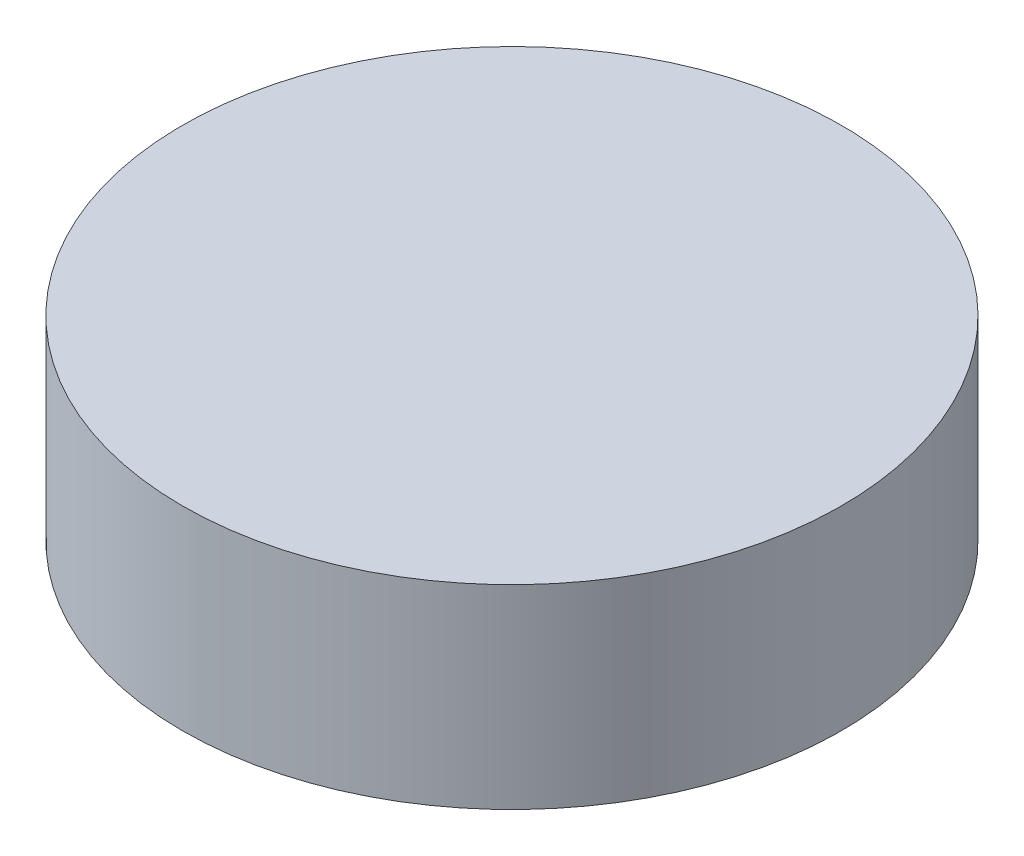
ISO-10303-21;
HEADER;
FILE_DESCRIPTION(('STEP AP214'),'2;1');
FILE_NAME('part.step','',(''),(''),'','','');
FILE_SCHEMA(('AUTOMOTIVE_DESIGN { 1 0 10303 214 1 1 1 1 }'));
ENDSEC;
DATA;
#1=APPLICATION_CONTEXT('core data for automotive mechanical design processes');
#2=APPLICATION_PROTOCOL_DEFINITION('international standard','automotive_design',2000,#1);
#3=PRODUCT_CONTEXT('',#1,'mechanical');
#4=PRODUCT('Part','Part','',(#3));
#5=PRODUCT_RELATED_PRODUCT_CATEGORY('part','',(#4));
#6=PRODUCT_DEFINITION_FORMATION('','',#4);
#7=PRODUCT_DEFINITION_CONTEXT('part definition',#1,'design');
#8=PRODUCT_DEFINITION('design','',#6,#7);
#9=PRODUCT_DEFINITION_SHAPE('','',#8);
#10=(LENGTH_UNIT() NAMED_UNIT(*) SI_UNIT(.MILLI.,.METRE.));
#11=(NAMED_UNIT(*) PLANE_ANGLE_UNIT() SI_UNIT($,.RADIAN.));
#12=(NAMED_UNIT(*) SI_UNIT($,.STERADIAN.) SOLID_ANGLE_UNIT());
#13=UNCERTAINTY_MEASURE_WITH_UNIT(LENGTH_MEASURE(1.E-05),#10,'distance_accuracy_value','');
#14=(GEOMETRIC_REPRESENTATION_CONTEXT(3) GLOBAL_UNCERTAINTY_ASSIGNED_CONTEXT((#13)) GLOBAL_UNIT_ASSIGNED_CONTEXT((#10,
#11,#12)) REPRESENTATION_CONTEXT('',''));
#15=CARTESIAN_POINT('',(0.,0.,0.));
#16=DIRECTION('',(0.,0.,1.));
#17=DIRECTION('',(1.,0.,0.));
#18=AXIS2_PLACEMENT_3D('',#15,#16,#17);
#19=CARTESIAN_POINT('',(0.,82.55,0.));
#20=DIRECTION('',(0.,-1.,0.));
#21=DIRECTION('',(0.,0.,-1.));
#22=AXIS2_PLACEMENT_3D('',#19,#20,#21);
#23=CYLINDRICAL_SURFACE('',#22,139.7);
#24=CARTESIAN_POINT('',(0.,82.55,0.));
#25=DIRECTION('',(0.,1.,0.));
#26=DIRECTION('',(0.,0.,1.));
#27=AXIS2_PLACEMENT_3D('',#24,#25,#26);
#28=CIRCLE('',#27,139.7);
#29=CARTESIAN_POINT('',(0.,82.55,139.7));
#30=VERTEX_POINT('',#29);
#31=EDGE_CURVE('E10',#30,#30,#28,.T.);
#32=ORIENTED_EDGE('',*,*,#31,.F.);
#33=EDGE_LOOP('',(#32));
#34=FACE_BOUND('',#33,.T.);
#35=CARTESIAN_POINT('',(0.,0.,0.));
#36=DIRECTION('',(0.,1.,0.));
#37=DIRECTION('',(0.,0.,1.));
#38=AXIS2_PLACEMENT_3D('',#35,#36,#37);
#39=CIRCLE('',#38,139.7);
#40=CARTESIAN_POINT('',(0.,0.,139.7));
#41=VERTEX_POINT('',#40);
#42=EDGE_CURVE('E33',#41,#41,#39,.T.);
#43=ORIENTED_EDGE('',*,*,#42,.T.);
#44=EDGE_LOOP('',(#43));
#45=FACE_BOUND('',#44,.T.);
#46=ADVANCED_FACE('F30',(#34,#45),#23,.T.);
#47=CARTESIAN_POINT('',(0.,82.55,0.));
#48=DIRECTION('',(0.,1.,0.));
#49=DIRECTION('',(0.,0.,1.));
#50=AXIS2_PLACEMENT_3D('',#47,#48,#49);
#51=PLANE('',#50);
#52=ORIENTED_EDGE('',*,*,#31,.T.);
#53=EDGE_LOOP('',(#52));
#54=FACE_BOUND('',#53,.T.);
#55=ADVANCED_FACE('F45',(#54),#51,.T.);
#56=CARTESIAN_POINT('',(0.,0.,0.));
#57=DIRECTION('',(0.,1.,0.));
#58=DIRECTION('',(0.,0.,1.));
#59=AXIS2_PLACEMENT_3D('',#56,#57,#58);
#60=PLANE('',#59);
#61=ORIENTED_EDGE('',*,*,#42,.F.);
#62=EDGE_LOOP('',(#61));
#63=FACE_BOUND('',#62,.T.);
#64=ADVANCED_FACE('F43',(#63),#60,.F.);
#65=CLOSED_SHELL('',(#46,#55,#64));
#66=MANIFOLD_SOLID_BREP('B2',#65);
#67=ADVANCED_BREP_SHAPE_REPRESENTATION('',(#18,#66),#14);
#68=SHAPE_DEFINITION_REPRESENTATION(#9,#67);
ENDSEC;
END-ISO-10303-21;
